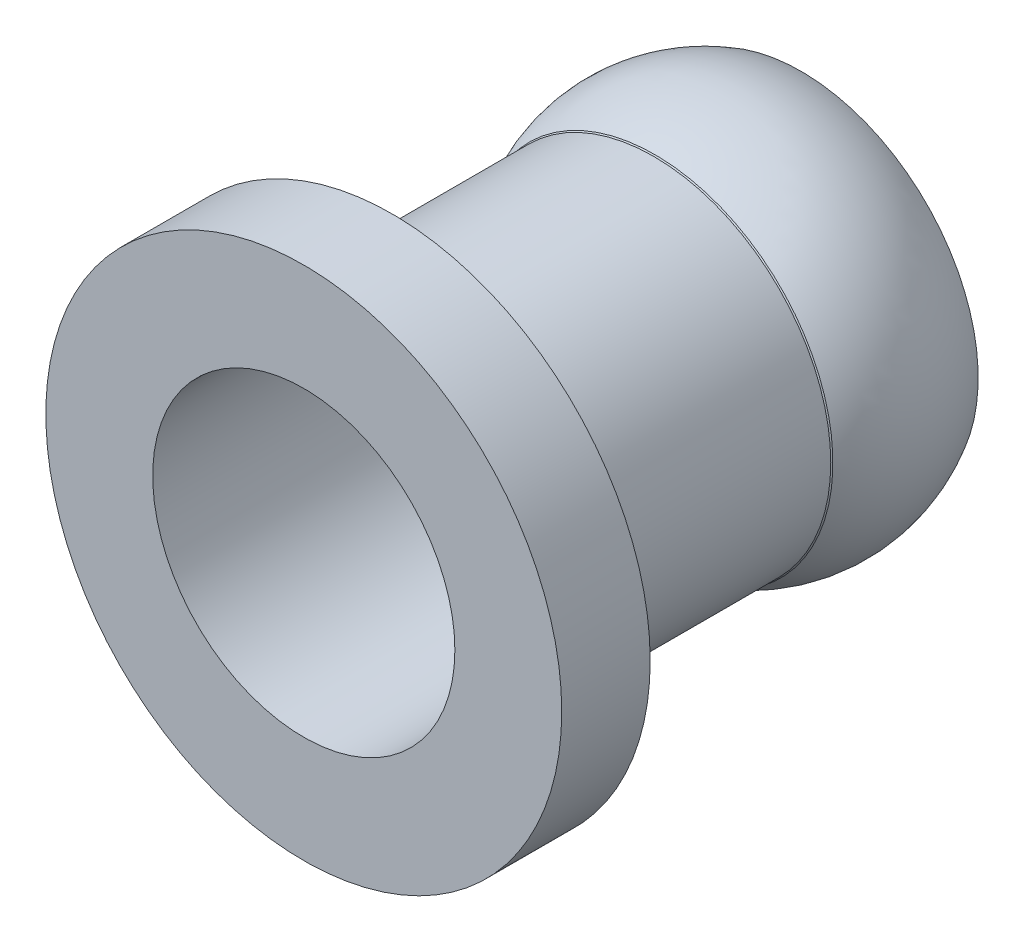
ISO-10303-21;
HEADER;
FILE_DESCRIPTION(('STEP AP214'),'2;1');
FILE_NAME('part.step','',(''),(''),'','','');
FILE_SCHEMA(('AUTOMOTIVE_DESIGN { 1 0 10303 214 1 1 1 1 }'));
ENDSEC;
DATA;
#1=APPLICATION_CONTEXT('core data for automotive mechanical design processes');
#2=APPLICATION_PROTOCOL_DEFINITION('international standard','automotive_design',2000,#1);
#3=PRODUCT_CONTEXT('',#1,'mechanical');
#4=PRODUCT('Part','Part','',(#3));
#5=PRODUCT_RELATED_PRODUCT_CATEGORY('part','',(#4));
#6=PRODUCT_DEFINITION_FORMATION('','',#4);
#7=PRODUCT_DEFINITION_CONTEXT('part definition',#1,'design');
#8=PRODUCT_DEFINITION('design','',#6,#7);
#9=PRODUCT_DEFINITION_SHAPE('','',#8);
#10=(LENGTH_UNIT() NAMED_UNIT(*) SI_UNIT(.MILLI.,.METRE.));
#11=(NAMED_UNIT(*) PLANE_ANGLE_UNIT() SI_UNIT($,.RADIAN.));
#12=(NAMED_UNIT(*) SI_UNIT($,.STERADIAN.) SOLID_ANGLE_UNIT());
#13=UNCERTAINTY_MEASURE_WITH_UNIT(LENGTH_MEASURE(1.E-05),#10,'distance_accuracy_value','');
#14=(GEOMETRIC_REPRESENTATION_CONTEXT(3) GLOBAL_UNCERTAINTY_ASSIGNED_CONTEXT((#13)) GLOBAL_UNIT_ASSIGNED_CONTEXT((#10,
#11,#12)) REPRESENTATION_CONTEXT('',''));
#15=CARTESIAN_POINT('',(0.,0.,0.));
#16=DIRECTION('',(0.,0.,1.));
#17=DIRECTION('',(1.,0.,0.));
#18=AXIS2_PLACEMENT_3D('',#15,#16,#17);
#19=CARTESIAN_POINT('',(0.,0.,3.775));
#20=DIRECTION('',(0.,0.,1.));
#21=DIRECTION('',(1.,0.,0.));
#22=AXIS2_PLACEMENT_3D('',#19,#20,#21);
#23=CYLINDRICAL_SURFACE('',#22,2.4);
#24=CARTESIAN_POINT('',(0.,0.,2.00000000000955));
#25=DIRECTION('',(0.,0.,-1.));
#26=DIRECTION('',(-1.,0.,0.));
#27=AXIS2_PLACEMENT_3D('',#24,#25,#26);
#28=CIRCLE('',#27,2.40000000002282);
#29=CARTESIAN_POINT('',(-2.40000000002283,0.,2.00000000000955));
#30=VERTEX_POINT('',#29);
#31=EDGE_CURVE('E35',#30,#30,#28,.T.);
#32=ORIENTED_EDGE('',*,*,#31,.F.);
#33=EDGE_LOOP('',(#32));
#34=FACE_BOUND('',#33,.T.);
#35=CARTESIAN_POINT('',(0.,0.,5.55));
#36=DIRECTION('',(0.,0.,1.));
#37=DIRECTION('',(1.,0.,0.));
#38=AXIS2_PLACEMENT_3D('',#35,#36,#37);
#39=CIRCLE('',#38,2.4);
#40=CARTESIAN_POINT('',(2.4,0.,5.55));
#41=VERTEX_POINT('',#40);
#42=EDGE_CURVE('E18',#41,#41,#39,.T.);
#43=ORIENTED_EDGE('',*,*,#42,.F.);
#44=EDGE_LOOP('',(#43));
#45=FACE_BOUND('',#44,.T.);
#46=ADVANCED_FACE('F14',(#34,#45),#23,.T.);
#47=CARTESIAN_POINT('',(3.5,0.,5.55));
#48=DIRECTION('',(0.,0.,-1.));
#49=DIRECTION('',(-1.,0.,0.));
#50=AXIS2_PLACEMENT_3D('',#47,#48,#49);
#51=PLANE('',#50);
#52=ORIENTED_EDGE('',*,*,#42,.T.);
#53=EDGE_LOOP('',(#52));
#54=FACE_BOUND('',#53,.T.);
#55=CARTESIAN_POINT('',(0.,0.,5.55));
#56=DIRECTION('',(0.,0.,1.));
#57=DIRECTION('',(1.,0.,0.));
#58=AXIS2_PLACEMENT_3D('',#55,#56,#57);
#59=CIRCLE('',#58,3.50000000000001);
#60=CARTESIAN_POINT('',(3.5,0.,5.55));
#61=VERTEX_POINT('',#60);
#62=EDGE_CURVE('E44',#61,#61,#59,.T.);
#63=ORIENTED_EDGE('',*,*,#62,.F.);
#64=EDGE_LOOP('',(#63));
#65=FACE_BOUND('',#64,.T.);
#66=ADVANCED_FACE('F58',(#54,#65),#51,.T.);
#67=CARTESIAN_POINT('',(0.,0.,1.9855814781522));
#68=DIRECTION('',(0.,0.,-1.));
#69=DIRECTION('',(-1.,0.,0.));
#70=AXIS2_PLACEMENT_3D('',#67,#68,#69);
#71=CONICAL_SURFACE('',#70,2.41441852188017,0.785398163397448);
#72=ORIENTED_EDGE('',*,*,#31,.T.);
#73=EDGE_LOOP('',(#72));
#74=FACE_BOUND('',#73,.T.);
#75=CARTESIAN_POINT('',(0.,0.,1.98558147805007));
#76=DIRECTION('',(0.,0.,-1.));
#77=DIRECTION('',(-1.,0.,0.));
#78=AXIS2_PLACEMENT_3D('',#75,#76,#77);
#79=CIRCLE('',#78,2.41441852194479);
#80=CARTESIAN_POINT('',(-2.4144185219448,0.,1.98558147805007));
#81=VERTEX_POINT('',#80);
#82=EDGE_CURVE('E43',#81,#81,#79,.T.);
#83=ORIENTED_EDGE('',*,*,#82,.F.);
#84=EDGE_LOOP('',(#83));
#85=FACE_BOUND('',#84,.T.);
#86=ADVANCED_FACE('F67',(#74,#85),#71,.T.);
#87=CARTESIAN_POINT('',(0.,0.,6.15));
#88=DIRECTION('',(0.,0.,1.));
#89=DIRECTION('',(1.,0.,0.));
#90=AXIS2_PLACEMENT_3D('',#87,#88,#89);
#91=CYLINDRICAL_SURFACE('',#90,3.50000000000001);
#92=ORIENTED_EDGE('',*,*,#62,.T.);
#93=EDGE_LOOP('',(#92));
#94=FACE_BOUND('',#93,.T.);
#95=CARTESIAN_POINT('',(0.,0.,6.75000000000002));
#96=DIRECTION('',(0.,0.,1.));
#97=DIRECTION('',(1.,0.,0.));
#98=AXIS2_PLACEMENT_3D('',#95,#96,#97);
#99=CIRCLE('',#98,3.50000000000001);
#100=CARTESIAN_POINT('',(3.5,0.,6.75000000000002));
#101=VERTEX_POINT('',#100);
#102=EDGE_CURVE('E40',#101,#101,#99,.T.);
#103=ORIENTED_EDGE('',*,*,#102,.F.);
#104=EDGE_LOOP('',(#103));
#105=FACE_BOUND('',#104,.T.);
#106=ADVANCED_FACE('F85',(#94,#105),#91,.T.);
#107=CARTESIAN_POINT('',(0.,0.,1.00539785843811));
#108=DIRECTION('',(0.,0.,-1.));
#109=DIRECTION('',(-1.,0.,0.));
#110=AXIS2_PLACEMENT_3D('',#107,#108,#109);
#111=DEGENERATE_TOROIDAL_SURFACE('',#110,0.671076882493598,2.,.T.);
#112=ORIENTED_EDGE('',*,*,#82,.T.);
#113=EDGE_LOOP('',(#112));
#114=FACE_BOUND('',#113,.T.);
#115=CARTESIAN_POINT('',(0.,0.,0.));
#116=DIRECTION('',(0.,0.,-1.));
#117=DIRECTION('',(-1.,0.,0.));
#118=AXIS2_PLACEMENT_3D('',#115,#116,#117);
#119=CIRCLE('',#118,2.39999999999999);
#120=CARTESIAN_POINT('',(-2.4,0.,0.));
#121=VERTEX_POINT('',#120);
#122=EDGE_CURVE('E32',#121,#121,#119,.T.);
#123=ORIENTED_EDGE('',*,*,#122,.F.);
#124=EDGE_LOOP('',(#123));
#125=FACE_BOUND('',#124,.T.);
#126=ADVANCED_FACE('F16',(#114,#125),#111,.T.);
#127=CARTESIAN_POINT('',(2.05,0.,6.74999999999999));
#128=DIRECTION('',(0.,0.,1.));
#129=DIRECTION('',(1.,0.,0.));
#130=AXIS2_PLACEMENT_3D('',#127,#128,#129);
#131=PLANE('',#130);
#132=CARTESIAN_POINT('',(0.,0.,6.75000000000002));
#133=DIRECTION('',(0.,0.,1.));
#134=DIRECTION('',(1.,0.,0.));
#135=AXIS2_PLACEMENT_3D('',#132,#133,#134);
#136=CIRCLE('',#135,2.05);
#137=CARTESIAN_POINT('',(2.05,0.,6.75000000000002));
#138=VERTEX_POINT('',#137);
#139=EDGE_CURVE('E23',#138,#138,#136,.F.);
#140=ORIENTED_EDGE('',*,*,#139,.T.);
#141=EDGE_LOOP('',(#140));
#142=FACE_BOUND('',#141,.T.);
#143=ORIENTED_EDGE('',*,*,#102,.T.);
#144=EDGE_LOOP('',(#143));
#145=FACE_BOUND('',#144,.T.);
#146=ADVANCED_FACE('F77',(#142,#145),#131,.T.);
#147=CARTESIAN_POINT('',(3.,0.,0.));
#148=DIRECTION('',(0.,0.,-1.));
#149=DIRECTION('',(-1.,0.,0.));
#150=AXIS2_PLACEMENT_3D('',#147,#148,#149);
#151=PLANE('',#150);
#152=CARTESIAN_POINT('',(0.,0.,0.));
#153=DIRECTION('',(0.,0.,1.));
#154=DIRECTION('',(1.,0.,0.));
#155=AXIS2_PLACEMENT_3D('',#152,#153,#154);
#156=CIRCLE('',#155,2.05);
#157=CARTESIAN_POINT('',(2.05,0.,0.));
#158=VERTEX_POINT('',#157);
#159=EDGE_CURVE('E10',#158,#158,#156,.T.);
#160=ORIENTED_EDGE('',*,*,#159,.T.);
#161=EDGE_LOOP('',(#160));
#162=FACE_BOUND('',#161,.T.);
#163=ORIENTED_EDGE('',*,*,#122,.T.);
#164=EDGE_LOOP('',(#163));
#165=FACE_BOUND('',#164,.T.);
#166=ADVANCED_FACE('F71',(#162,#165),#151,.T.);
#167=CARTESIAN_POINT('',(0.,0.,3.375));
#168=DIRECTION('',(0.,0.,1.));
#169=DIRECTION('',(1.,0.,0.));
#170=AXIS2_PLACEMENT_3D('',#167,#168,#169);
#171=CYLINDRICAL_SURFACE('',#170,2.05);
#172=ORIENTED_EDGE('',*,*,#139,.F.);
#173=EDGE_LOOP('',(#172));
#174=FACE_BOUND('',#173,.T.);
#175=ORIENTED_EDGE('',*,*,#159,.F.);
#176=EDGE_LOOP('',(#175));
#177=FACE_BOUND('',#176,.T.);
#178=ADVANCED_FACE('F69',(#174,#177),#171,.F.);
#179=CLOSED_SHELL('',(#46,#66,#86,#106,#126,#146,#166,#178));
#180=MANIFOLD_SOLID_BREP('B1',#179);
#181=ADVANCED_BREP_SHAPE_REPRESENTATION('',(#18,#180),#14);
#182=SHAPE_DEFINITION_REPRESENTATION(#9,#181);
ENDSEC;
END-ISO-10303-21;
